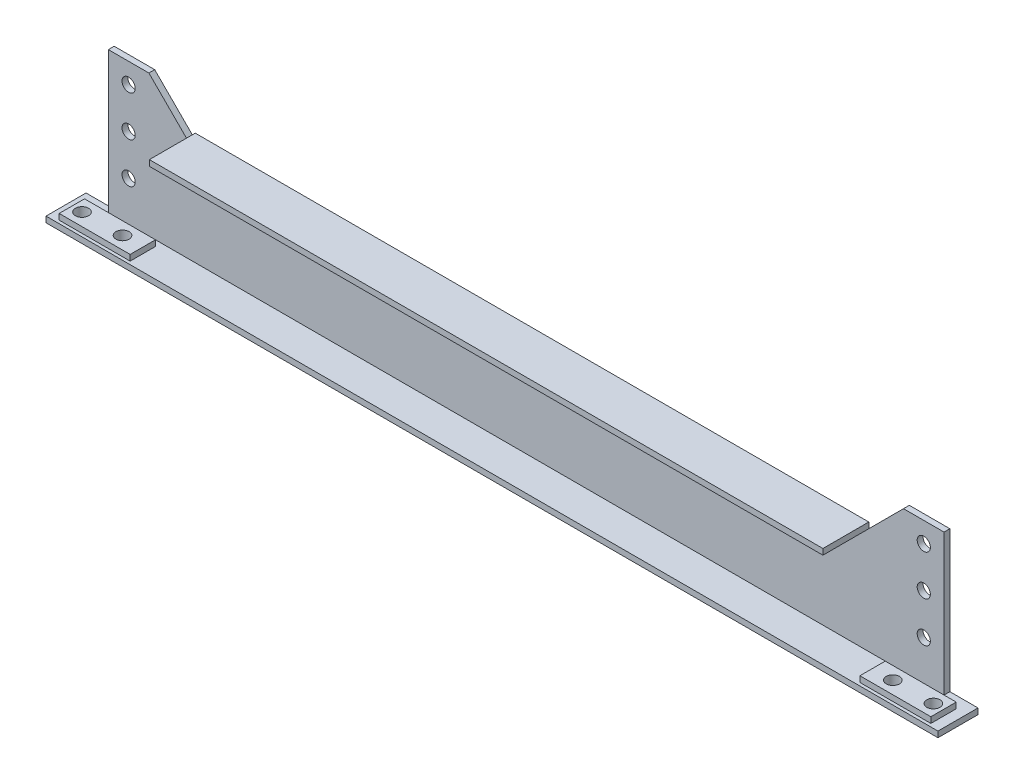
ISO-10303-21;
HEADER;
FILE_DESCRIPTION(('STEP AP214'),'2;1');
FILE_NAME('part.step','',(''),(''),'','','');
FILE_SCHEMA(('AUTOMOTIVE_DESIGN { 1 0 10303 214 1 1 1 1 }'));
ENDSEC;
DATA;
#1=APPLICATION_CONTEXT('core data for automotive mechanical design processes');
#2=APPLICATION_PROTOCOL_DEFINITION('international standard','automotive_design',2000,#1);
#3=PRODUCT_CONTEXT('',#1,'mechanical');
#4=PRODUCT('Part','Part','',(#3));
#5=PRODUCT_RELATED_PRODUCT_CATEGORY('part','',(#4));
#6=PRODUCT_DEFINITION_FORMATION('','',#4);
#7=PRODUCT_DEFINITION_CONTEXT('part definition',#1,'design');
#8=PRODUCT_DEFINITION('design','',#6,#7);
#9=PRODUCT_DEFINITION_SHAPE('','',#8);
#10=(LENGTH_UNIT() NAMED_UNIT(*) SI_UNIT(.MILLI.,.METRE.));
#11=(NAMED_UNIT(*) PLANE_ANGLE_UNIT() SI_UNIT($,.RADIAN.));
#12=(NAMED_UNIT(*) SI_UNIT($,.STERADIAN.) SOLID_ANGLE_UNIT());
#13=UNCERTAINTY_MEASURE_WITH_UNIT(LENGTH_MEASURE(1.E-05),#10,'distance_accuracy_value','');
#14=(GEOMETRIC_REPRESENTATION_CONTEXT(3) GLOBAL_UNCERTAINTY_ASSIGNED_CONTEXT((#13)) GLOBAL_UNIT_ASSIGNED_CONTEXT((#10,
#11,#12)) REPRESENTATION_CONTEXT('',''));
#15=CARTESIAN_POINT('',(0.,0.,0.));
#16=DIRECTION('',(0.,0.,1.));
#17=DIRECTION('',(1.,0.,0.));
#18=AXIS2_PLACEMENT_3D('',#15,#16,#17);
#19=CARTESIAN_POINT('',(880.,-139.25,79.));
#20=DIRECTION('',(0.,-1.,0.));
#21=DIRECTION('',(1.,0.,0.));
#22=AXIS2_PLACEMENT_3D('',#19,#20,#21);
#23=PLANE('',#22);
#24=DIRECTION('',(0.,0.,1.));
#25=VECTOR('',#24,1.);
#26=CARTESIAN_POINT('',(720.,-139.25,23.));
#27=LINE('',#26,#25);
#28=CARTESIAN_POINT('',(720.,-139.25,23.));
#29=VERTEX_POINT('',#28);
#30=CARTESIAN_POINT('',(720.,-139.25,73.));
#31=VERTEX_POINT('',#30);
#32=EDGE_CURVE('E214',#29,#31,#27,.T.);
#33=ORIENTED_EDGE('',*,*,#32,.F.);
#34=DIRECTION('',(-1.,0.,0.));
#35=VECTOR('',#34,1.);
#36=CARTESIAN_POINT('',(720.,-139.25,23.));
#37=LINE('',#36,#35);
#38=CARTESIAN_POINT('',(860.,-139.25,23.));
#39=VERTEX_POINT('',#38);
#40=EDGE_CURVE('E227',#39,#29,#37,.T.);
#41=ORIENTED_EDGE('',*,*,#40,.F.);
#42=DIRECTION('',(0.,0.,-1.));
#43=VECTOR('',#42,1.);
#44=CARTESIAN_POINT('',(860.,-139.25,23.));
#45=LINE('',#44,#43);
#46=CARTESIAN_POINT('',(860.,-139.25,73.));
#47=VERTEX_POINT('',#46);
#48=EDGE_CURVE('E236',#47,#39,#45,.T.);
#49=ORIENTED_EDGE('',*,*,#48,.F.);
#50=DIRECTION('',(1.,0.,0.));
#51=VECTOR('',#50,1.);
#52=CARTESIAN_POINT('',(720.,-139.25,73.));
#53=LINE('',#52,#51);
#54=EDGE_CURVE('E217',#31,#47,#53,.T.);
#55=ORIENTED_EDGE('',*,*,#54,.F.);
#56=EDGE_LOOP('',(#33,#41,#49,#55));
#57=FACE_BOUND('',#56,.T.);
#58=DIRECTION('',(0.,0.,-1.));
#59=VECTOR('',#58,1.);
#60=CARTESIAN_POINT('',(824.5,-139.25,11.5));
#61=LINE('',#60,#59);
#62=CARTESIAN_POINT('',(824.5,-139.25,11.5));
#63=VERTEX_POINT('',#62);
#64=CARTESIAN_POINT('',(824.5,-139.25,0.));
#65=VERTEX_POINT('',#64);
#66=EDGE_CURVE('E45',#63,#65,#61,.T.);
#67=ORIENTED_EDGE('',*,*,#66,.F.);
#68=DIRECTION('',(1.,0.,0.));
#69=VECTOR('',#68,1.);
#70=CARTESIAN_POINT('',(-824.5,-139.25,11.5));
#71=LINE('',#70,#69);
#72=CARTESIAN_POINT('',(-824.5,-139.25,11.5));
#73=VERTEX_POINT('',#72);
#74=EDGE_CURVE('E523',#73,#63,#71,.T.);
#75=ORIENTED_EDGE('',*,*,#74,.F.);
#76=DIRECTION('',(0.,0.,-1.));
#77=VECTOR('',#76,1.);
#78=CARTESIAN_POINT('',(-824.5,-139.25,11.5));
#79=LINE('',#78,#77);
#80=CARTESIAN_POINT('',(-824.5,-139.25,0.));
#81=VERTEX_POINT('',#80);
#82=EDGE_CURVE('E11',#73,#81,#79,.T.);
#83=ORIENTED_EDGE('',*,*,#82,.T.);
#84=DIRECTION('',(-1.,0.,0.));
#85=VECTOR('',#84,1.);
#86=CARTESIAN_POINT('',(880.,-139.25,0.));
#87=LINE('',#86,#85);
#88=CARTESIAN_POINT('',(-880.,-139.25,0.));
#89=VERTEX_POINT('',#88);
#90=EDGE_CURVE('E255',#81,#89,#87,.T.);
#91=ORIENTED_EDGE('',*,*,#90,.T.);
#92=DIRECTION('',(0.,0.,-1.));
#93=VECTOR('',#92,1.);
#94=CARTESIAN_POINT('',(-880.,-139.25,79.));
#95=LINE('',#94,#93);
#96=CARTESIAN_POINT('',(-880.,-139.25,79.));
#97=VERTEX_POINT('',#96);
#98=EDGE_CURVE('E270',#97,#89,#95,.T.);
#99=ORIENTED_EDGE('',*,*,#98,.F.);
#100=DIRECTION('',(-1.,0.,0.));
#101=VECTOR('',#100,1.);
#102=CARTESIAN_POINT('',(880.,-139.25,79.));
#103=LINE('',#102,#101);
#104=CARTESIAN_POINT('',(880.,-139.25,79.));
#105=VERTEX_POINT('',#104);
#106=EDGE_CURVE('E281',#105,#97,#103,.T.);
#107=ORIENTED_EDGE('',*,*,#106,.F.);
#108=DIRECTION('',(0.,0.,-1.));
#109=VECTOR('',#108,1.);
#110=CARTESIAN_POINT('',(880.,-139.25,79.));
#111=LINE('',#110,#109);
#112=CARTESIAN_POINT('',(880.,-139.25,0.));
#113=VERTEX_POINT('',#112);
#114=EDGE_CURVE('E267',#105,#113,#111,.T.);
#115=ORIENTED_EDGE('',*,*,#114,.T.);
#116=EDGE_CURVE('E264',#113,#65,#87,.T.);
#117=ORIENTED_EDGE('',*,*,#116,.T.);
#118=EDGE_LOOP('',(#67,#75,#83,#91,#99,#107,#115,#117));
#119=FACE_BOUND('',#118,.T.);
#120=DIRECTION('',(0.,0.,-1.));
#121=VECTOR('',#120,1.);
#122=CARTESIAN_POINT('',(-720.,-139.25,23.));
#123=LINE('',#122,#121);
#124=CARTESIAN_POINT('',(-720.,-139.25,73.));
#125=VERTEX_POINT('',#124);
#126=CARTESIAN_POINT('',(-720.,-139.25,23.));
#127=VERTEX_POINT('',#126);
#128=EDGE_CURVE('E213',#125,#127,#123,.T.);
#129=ORIENTED_EDGE('',*,*,#128,.F.);
#130=DIRECTION('',(1.,0.,0.));
#131=VECTOR('',#130,1.);
#132=CARTESIAN_POINT('',(-720.,-139.25,73.));
#133=LINE('',#132,#131);
#134=CARTESIAN_POINT('',(-860.,-139.25,73.));
#135=VERTEX_POINT('',#134);
#136=EDGE_CURVE('E210',#135,#125,#133,.T.);
#137=ORIENTED_EDGE('',*,*,#136,.F.);
#138=DIRECTION('',(0.,0.,1.));
#139=VECTOR('',#138,1.);
#140=CARTESIAN_POINT('',(-860.,-139.25,23.));
#141=LINE('',#140,#139);
#142=CARTESIAN_POINT('',(-860.,-139.25,23.));
#143=VERTEX_POINT('',#142);
#144=EDGE_CURVE('E58',#143,#135,#141,.T.);
#145=ORIENTED_EDGE('',*,*,#144,.F.);
#146=DIRECTION('',(-1.,0.,0.));
#147=VECTOR('',#146,1.);
#148=CARTESIAN_POINT('',(-720.,-139.25,23.));
#149=LINE('',#148,#147);
#150=EDGE_CURVE('E53',#127,#143,#149,.T.);
#151=ORIENTED_EDGE('',*,*,#150,.F.);
#152=EDGE_LOOP('',(#129,#137,#145,#151));
#153=FACE_BOUND('',#152,.T.);
#154=ADVANCED_FACE('F36',(#57,#119,#153),#23,.F.);
#155=CARTESIAN_POINT('',(-824.5,59.2499999999996,11.5));
#156=DIRECTION('',(0.,0.,1.));
#157=DIRECTION('',(1.,0.,0.));
#158=AXIS2_PLACEMENT_3D('',#155,#156,#157);
#159=PLANE('',#158);
#160=CARTESIAN_POINT('',(784.5,19.2499999999996,11.5));
#161=DIRECTION('',(0.,0.,1.));
#162=DIRECTION('',(-1.,0.,0.));
#163=AXIS2_PLACEMENT_3D('',#160,#161,#162);
#164=CIRCLE('',#163,13.);
#165=CARTESIAN_POINT('',(771.5,19.2499999999996,11.5));
#166=VERTEX_POINT('',#165);
#167=EDGE_CURVE('E545',#166,#166,#164,.T.);
#168=ORIENTED_EDGE('',*,*,#167,.F.);
#169=EDGE_LOOP('',(#168));
#170=FACE_BOUND('',#169,.T.);
#171=CARTESIAN_POINT('',(-784.5,-60.7500000000004,11.5));
#172=DIRECTION('',(0.,0.,1.));
#173=DIRECTION('',(1.,0.,0.));
#174=AXIS2_PLACEMENT_3D('',#171,#172,#173);
#175=CIRCLE('',#174,13.);
#176=CARTESIAN_POINT('',(-771.5,-60.7500000000004,11.5));
#177=VERTEX_POINT('',#176);
#178=EDGE_CURVE('E533',#177,#177,#175,.T.);
#179=ORIENTED_EDGE('',*,*,#178,.F.);
#180=EDGE_LOOP('',(#179));
#181=FACE_BOUND('',#180,.T.);
#182=CARTESIAN_POINT('',(-784.5,99.2499999999996,11.5));
#183=DIRECTION('',(0.,0.,1.));
#184=DIRECTION('',(1.,0.,0.));
#185=AXIS2_PLACEMENT_3D('',#182,#183,#184);
#186=CIRCLE('',#185,13.);
#187=CARTESIAN_POINT('',(-771.5,99.2499999999996,11.5));
#188=VERTEX_POINT('',#187);
#189=EDGE_CURVE('E324',#188,#188,#186,.T.);
#190=ORIENTED_EDGE('',*,*,#189,.F.);
#191=EDGE_LOOP('',(#190));
#192=FACE_BOUND('',#191,.T.);
#193=DIRECTION('',(0.,-1.,0.));
#194=VECTOR('',#193,1.);
#195=CARTESIAN_POINT('',(-824.5,139.25,11.5));
#196=LINE('',#195,#194);
#197=CARTESIAN_POINT('',(-824.5,139.25,11.5));
#198=VERTEX_POINT('',#197);
#199=EDGE_CURVE('E493',#198,#73,#196,.T.);
#200=ORIENTED_EDGE('',*,*,#199,.T.);
#201=ORIENTED_EDGE('',*,*,#74,.T.);
#202=DIRECTION('',(0.,1.,0.));
#203=VECTOR('',#202,1.);
#204=CARTESIAN_POINT('',(824.5,139.25,11.5));
#205=LINE('',#204,#203);
#206=CARTESIAN_POINT('',(824.5,139.25,11.5));
#207=VERTEX_POINT('',#206);
#208=EDGE_CURVE('E514',#63,#207,#205,.T.);
#209=ORIENTED_EDGE('',*,*,#208,.T.);
#210=DIRECTION('',(-1.,0.,0.));
#211=VECTOR('',#210,1.);
#212=CARTESIAN_POINT('',(744.5,139.25,11.5));
#213=LINE('',#212,#211);
#214=CARTESIAN_POINT('',(744.5,139.25,11.5));
#215=VERTEX_POINT('',#214);
#216=EDGE_CURVE('E478',#207,#215,#213,.T.);
#217=ORIENTED_EDGE('',*,*,#216,.T.);
#218=DIRECTION('',(-0.707106781186546,-0.707106781186549,0.));
#219=VECTOR('',#218,1.);
#220=CARTESIAN_POINT('',(744.5,139.25,11.5));
#221=LINE('',#220,#219);
#222=CARTESIAN_POINT('',(664.5,59.2499999999996,11.5));
#223=VERTEX_POINT('',#222);
#224=EDGE_CURVE('E507',#215,#223,#221,.T.);
#225=ORIENTED_EDGE('',*,*,#224,.T.);
#226=DIRECTION('',(-1.,0.,0.));
#227=VECTOR('',#226,1.);
#228=CARTESIAN_POINT('',(-664.5,59.2499999999996,11.5));
#229=LINE('',#228,#227);
#230=CARTESIAN_POINT('',(-664.5,59.2499999999996,11.5));
#231=VERTEX_POINT('',#230);
#232=EDGE_CURVE('E510',#223,#231,#229,.T.);
#233=ORIENTED_EDGE('',*,*,#232,.T.);
#234=DIRECTION('',(-0.707106781186547,0.707106781186548,0.));
#235=VECTOR('',#234,1.);
#236=CARTESIAN_POINT('',(-744.5,139.25,11.5));
#237=LINE('',#236,#235);
#238=CARTESIAN_POINT('',(-744.5,139.25,11.5));
#239=VERTEX_POINT('',#238);
#240=EDGE_CURVE('E512',#231,#239,#237,.T.);
#241=ORIENTED_EDGE('',*,*,#240,.T.);
#242=DIRECTION('',(-1.,0.,0.));
#243=VECTOR('',#242,1.);
#244=CARTESIAN_POINT('',(-824.5,139.25,11.5));
#245=LINE('',#244,#243);
#246=EDGE_CURVE('E488',#239,#198,#245,.T.);
#247=ORIENTED_EDGE('',*,*,#246,.T.);
#248=EDGE_LOOP('',(#200,#201,#209,#217,#225,#233,#241,#247));
#249=FACE_BOUND('',#248,.T.);
#250=CARTESIAN_POINT('',(-784.5,19.2499999999996,11.5));
#251=DIRECTION('',(0.,0.,1.));
#252=DIRECTION('',(1.,0.,0.));
#253=AXIS2_PLACEMENT_3D('',#250,#251,#252);
#254=CIRCLE('',#253,13.);
#255=CARTESIAN_POINT('',(-771.5,19.2499999999996,11.5));
#256=VERTEX_POINT('',#255);
#257=EDGE_CURVE('E528',#256,#256,#254,.T.);
#258=ORIENTED_EDGE('',*,*,#257,.F.);
#259=EDGE_LOOP('',(#258));
#260=FACE_BOUND('',#259,.T.);
#261=CARTESIAN_POINT('',(784.5,-60.7500000000004,11.5));
#262=DIRECTION('',(0.,0.,1.));
#263=DIRECTION('',(-1.,0.,0.));
#264=AXIS2_PLACEMENT_3D('',#261,#262,#263);
#265=CIRCLE('',#264,13.);
#266=CARTESIAN_POINT('',(771.5,-60.7500000000004,11.5));
#267=VERTEX_POINT('',#266);
#268=EDGE_CURVE('E539',#267,#267,#265,.T.);
#269=ORIENTED_EDGE('',*,*,#268,.F.);
#270=EDGE_LOOP('',(#269));
#271=FACE_BOUND('',#270,.T.);
#272=CARTESIAN_POINT('',(784.5,99.2499999999996,11.5));
#273=DIRECTION('',(0.,0.,1.));
#274=DIRECTION('',(-1.,0.,0.));
#275=AXIS2_PLACEMENT_3D('',#272,#273,#274);
#276=CIRCLE('',#275,13.);
#277=CARTESIAN_POINT('',(771.5,99.2499999999996,11.5));
#278=VERTEX_POINT('',#277);
#279=EDGE_CURVE('E551',#278,#278,#276,.T.);
#280=ORIENTED_EDGE('',*,*,#279,.F.);
#281=EDGE_LOOP('',(#280));
#282=FACE_BOUND('',#281,.T.);
#283=ADVANCED_FACE('F390',(#170,#181,#192,#249,#260,#271,#282),#159,.T.);
#284=CARTESIAN_POINT('',(-824.5,59.2499999999996,0.));
#285=DIRECTION('',(0.,0.,1.));
#286=DIRECTION('',(1.,0.,0.));
#287=AXIS2_PLACEMENT_3D('',#284,#285,#286);
#288=PLANE('',#287);
#289=CARTESIAN_POINT('',(784.5,19.2499999999996,0.));
#290=DIRECTION('',(0.,0.,1.));
#291=DIRECTION('',(-1.,0.,0.));
#292=AXIS2_PLACEMENT_3D('',#289,#290,#291);
#293=CIRCLE('',#292,13.);
#294=CARTESIAN_POINT('',(771.5,19.2499999999996,0.));
#295=VERTEX_POINT('',#294);
#296=EDGE_CURVE('E548',#295,#295,#293,.T.);
#297=ORIENTED_EDGE('',*,*,#296,.T.);
#298=EDGE_LOOP('',(#297));
#299=FACE_BOUND('',#298,.T.);
#300=CARTESIAN_POINT('',(-784.5,-60.7500000000004,0.));
#301=DIRECTION('',(0.,0.,1.));
#302=DIRECTION('',(1.,0.,0.));
#303=AXIS2_PLACEMENT_3D('',#300,#301,#302);
#304=CIRCLE('',#303,13.);
#305=CARTESIAN_POINT('',(-771.5,-60.7500000000004,0.));
#306=VERTEX_POINT('',#305);
#307=EDGE_CURVE('E536',#306,#306,#304,.T.);
#308=ORIENTED_EDGE('',*,*,#307,.T.);
#309=EDGE_LOOP('',(#308));
#310=FACE_BOUND('',#309,.T.);
#311=CARTESIAN_POINT('',(-784.5,99.2499999999996,0.));
#312=DIRECTION('',(0.,0.,1.));
#313=DIRECTION('',(1.,0.,0.));
#314=AXIS2_PLACEMENT_3D('',#311,#312,#313);
#315=CIRCLE('',#314,13.);
#316=CARTESIAN_POINT('',(-771.5,99.2499999999996,0.));
#317=VERTEX_POINT('',#316);
#318=EDGE_CURVE('E329',#317,#317,#315,.T.);
#319=ORIENTED_EDGE('',*,*,#318,.T.);
#320=EDGE_LOOP('',(#319));
#321=FACE_BOUND('',#320,.T.);
#322=DIRECTION('',(0.,-1.,0.));
#323=VECTOR('',#322,1.);
#324=CARTESIAN_POINT('',(-824.5,139.25,0.));
#325=LINE('',#324,#323);
#326=CARTESIAN_POINT('',(-824.5,139.25,0.));
#327=VERTEX_POINT('',#326);
#328=EDGE_CURVE('E318',#327,#81,#325,.T.);
#329=ORIENTED_EDGE('',*,*,#328,.F.);
#330=DIRECTION('',(-1.,0.,0.));
#331=VECTOR('',#330,1.);
#332=CARTESIAN_POINT('',(-824.5,139.25,0.));
#333=LINE('',#332,#331);
#334=CARTESIAN_POINT('',(-744.5,139.25,0.));
#335=VERTEX_POINT('',#334);
#336=EDGE_CURVE('E320',#335,#327,#333,.T.);
#337=ORIENTED_EDGE('',*,*,#336,.F.);
#338=DIRECTION('',(-0.707106781186547,0.707106781186548,0.));
#339=VECTOR('',#338,1.);
#340=CARTESIAN_POINT('',(-744.5,139.25,0.));
#341=LINE('',#340,#339);
#342=CARTESIAN_POINT('',(-664.5,59.2499999999996,0.));
#343=VERTEX_POINT('',#342);
#344=EDGE_CURVE('E485',#343,#335,#341,.T.);
#345=ORIENTED_EDGE('',*,*,#344,.F.);
#346=DIRECTION('',(0.,-1.,0.));
#347=VECTOR('',#346,1.);
#348=CARTESIAN_POINT('',(-664.5,59.2499999999996,0.));
#349=LINE('',#348,#347);
#350=CARTESIAN_POINT('',(-664.5,70.7499999999995,0.));
#351=VERTEX_POINT('',#350);
#352=EDGE_CURVE('E269',#351,#343,#349,.T.);
#353=ORIENTED_EDGE('',*,*,#352,.F.);
#354=DIRECTION('',(-1.,0.,0.));
#355=VECTOR('',#354,1.);
#356=CARTESIAN_POINT('',(-664.5,70.7499999999995,0.));
#357=LINE('',#356,#355);
#358=CARTESIAN_POINT('',(664.5,70.7499999999995,0.));
#359=VERTEX_POINT('',#358);
#360=EDGE_CURVE('E578',#359,#351,#357,.T.);
#361=ORIENTED_EDGE('',*,*,#360,.F.);
#362=DIRECTION('',(0.,1.,0.));
#363=VECTOR('',#362,1.);
#364=CARTESIAN_POINT('',(664.5,59.2499999999996,0.));
#365=LINE('',#364,#363);
#366=CARTESIAN_POINT('',(664.5,59.2499999999996,0.));
#367=VERTEX_POINT('',#366);
#368=EDGE_CURVE('E581',#367,#359,#365,.T.);
#369=ORIENTED_EDGE('',*,*,#368,.F.);
#370=DIRECTION('',(-0.707106781186546,-0.707106781186549,0.));
#371=VECTOR('',#370,1.);
#372=CARTESIAN_POINT('',(744.5,139.25,0.));
#373=LINE('',#372,#371);
#374=CARTESIAN_POINT('',(744.5,139.25,0.));
#375=VERTEX_POINT('',#374);
#376=EDGE_CURVE('E483',#375,#367,#373,.T.);
#377=ORIENTED_EDGE('',*,*,#376,.F.);
#378=DIRECTION('',(-1.,0.,0.));
#379=VECTOR('',#378,1.);
#380=CARTESIAN_POINT('',(744.5,139.25,0.));
#381=LINE('',#380,#379);
#382=CARTESIAN_POINT('',(824.5,139.25,0.));
#383=VERTEX_POINT('',#382);
#384=EDGE_CURVE('E326',#383,#375,#381,.T.);
#385=ORIENTED_EDGE('',*,*,#384,.F.);
#386=DIRECTION('',(0.,1.,0.));
#387=VECTOR('',#386,1.);
#388=CARTESIAN_POINT('',(824.5,139.25,0.));
#389=LINE('',#388,#387);
#390=EDGE_CURVE('E323',#65,#383,#389,.T.);
#391=ORIENTED_EDGE('',*,*,#390,.F.);
#392=ORIENTED_EDGE('',*,*,#116,.F.);
#393=DIRECTION('',(0.,1.,0.));
#394=VECTOR('',#393,1.);
#395=CARTESIAN_POINT('',(880.,-139.25,0.));
#396=LINE('',#395,#394);
#397=CARTESIAN_POINT('',(880.,-150.75,0.));
#398=VERTEX_POINT('',#397);
#399=EDGE_CURVE('E252',#398,#113,#396,.T.);
#400=ORIENTED_EDGE('',*,*,#399,.F.);
#401=DIRECTION('',(1.,0.,0.));
#402=VECTOR('',#401,1.);
#403=CARTESIAN_POINT('',(880.,-150.75,0.));
#404=LINE('',#403,#402);
#405=CARTESIAN_POINT('',(-880.,-150.75,0.));
#406=VERTEX_POINT('',#405);
#407=EDGE_CURVE('E285',#406,#398,#404,.T.);
#408=ORIENTED_EDGE('',*,*,#407,.F.);
#409=DIRECTION('',(0.,-1.,0.));
#410=VECTOR('',#409,1.);
#411=CARTESIAN_POINT('',(-880.,-139.25,0.));
#412=LINE('',#411,#410);
#413=EDGE_CURVE('E258',#89,#406,#412,.T.);
#414=ORIENTED_EDGE('',*,*,#413,.F.);
#415=ORIENTED_EDGE('',*,*,#90,.F.);
#416=EDGE_LOOP('',(#329,#337,#345,#353,#361,#369,#377,#385,#391,#392,#400,#408,#414,#415));
#417=FACE_BOUND('',#416,.T.);
#418=CARTESIAN_POINT('',(-784.5,19.2499999999996,0.));
#419=DIRECTION('',(0.,0.,1.));
#420=DIRECTION('',(1.,0.,0.));
#421=AXIS2_PLACEMENT_3D('',#418,#419,#420);
#422=CIRCLE('',#421,13.);
#423=CARTESIAN_POINT('',(-771.5,19.2499999999996,0.));
#424=VERTEX_POINT('',#423);
#425=EDGE_CURVE('E530',#424,#424,#422,.T.);
#426=ORIENTED_EDGE('',*,*,#425,.T.);
#427=EDGE_LOOP('',(#426));
#428=FACE_BOUND('',#427,.T.);
#429=CARTESIAN_POINT('',(784.5,-60.7500000000004,0.));
#430=DIRECTION('',(0.,0.,1.));
#431=DIRECTION('',(-1.,0.,0.));
#432=AXIS2_PLACEMENT_3D('',#429,#430,#431);
#433=CIRCLE('',#432,13.);
#434=CARTESIAN_POINT('',(771.5,-60.7500000000004,0.));
#435=VERTEX_POINT('',#434);
#436=EDGE_CURVE('E542',#435,#435,#433,.T.);
#437=ORIENTED_EDGE('',*,*,#436,.T.);
#438=EDGE_LOOP('',(#437));
#439=FACE_BOUND('',#438,.T.);
#440=CARTESIAN_POINT('',(784.5,99.2499999999996,0.));
#441=DIRECTION('',(0.,0.,1.));
#442=DIRECTION('',(-1.,0.,0.));
#443=AXIS2_PLACEMENT_3D('',#440,#441,#442);
#444=CIRCLE('',#443,13.);
#445=CARTESIAN_POINT('',(771.5,99.2499999999996,0.));
#446=VERTEX_POINT('',#445);
#447=EDGE_CURVE('E554',#446,#446,#444,.T.);
#448=ORIENTED_EDGE('',*,*,#447,.T.);
#449=EDGE_LOOP('',(#448));
#450=FACE_BOUND('',#449,.T.);
#451=ADVANCED_FACE('F302',(#299,#310,#321,#417,#428,#439,#450),#288,.F.);
#452=CARTESIAN_POINT('',(-824.5,139.25,11.5));
#453=DIRECTION('',(1.,0.,0.));
#454=DIRECTION('',(0.,0.,-1.));
#455=AXIS2_PLACEMENT_3D('',#452,#453,#454);
#456=PLANE('',#455);
#457=ORIENTED_EDGE('',*,*,#328,.T.);
#458=ORIENTED_EDGE('',*,*,#82,.F.);
#459=ORIENTED_EDGE('',*,*,#199,.F.);
#460=DIRECTION('',(0.,0.,-1.));
#461=VECTOR('',#460,1.);
#462=CARTESIAN_POINT('',(-824.5,139.25,11.5));
#463=LINE('',#462,#461);
#464=EDGE_CURVE('E494',#198,#327,#463,.T.);
#465=ORIENTED_EDGE('',*,*,#464,.T.);
#466=EDGE_LOOP('',(#457,#458,#459,#465));
#467=FACE_BOUND('',#466,.T.);
#468=ADVANCED_FACE('F38',(#467),#456,.F.);
#469=CARTESIAN_POINT('',(824.5,139.25,11.5));
#470=DIRECTION('',(-1.,0.,0.));
#471=DIRECTION('',(0.,0.,1.));
#472=AXIS2_PLACEMENT_3D('',#469,#470,#471);
#473=PLANE('',#472);
#474=ORIENTED_EDGE('',*,*,#390,.T.);
#475=DIRECTION('',(0.,0.,-1.));
#476=VECTOR('',#475,1.);
#477=CARTESIAN_POINT('',(824.5,139.25,11.5));
#478=LINE('',#477,#476);
#479=EDGE_CURVE('E338',#207,#383,#478,.T.);
#480=ORIENTED_EDGE('',*,*,#479,.F.);
#481=ORIENTED_EDGE('',*,*,#208,.F.);
#482=ORIENTED_EDGE('',*,*,#66,.T.);
#483=EDGE_LOOP('',(#474,#480,#481,#482));
#484=FACE_BOUND('',#483,.T.);
#485=ADVANCED_FACE('F464',(#484),#473,.F.);
#486=CARTESIAN_POINT('',(744.5,139.25,11.5));
#487=DIRECTION('',(0.,-1.,0.));
#488=DIRECTION('',(1.,0.,0.));
#489=AXIS2_PLACEMENT_3D('',#486,#487,#488);
#490=PLANE('',#489);
#491=ORIENTED_EDGE('',*,*,#384,.T.);
#492=DIRECTION('',(0.,0.,-1.));
#493=VECTOR('',#492,1.);
#494=CARTESIAN_POINT('',(744.5,139.25,11.5));
#495=LINE('',#494,#493);
#496=EDGE_CURVE('E479',#215,#375,#495,.T.);
#497=ORIENTED_EDGE('',*,*,#496,.F.);
#498=ORIENTED_EDGE('',*,*,#216,.F.);
#499=ORIENTED_EDGE('',*,*,#479,.T.);
#500=EDGE_LOOP('',(#491,#497,#498,#499));
#501=FACE_BOUND('',#500,.T.);
#502=ADVANCED_FACE('F461',(#501),#490,.F.);
#503=CARTESIAN_POINT('',(744.5,139.25,11.5));
#504=DIRECTION('',(0.707106781186549,-0.707106781186546,0.));
#505=DIRECTION('',(0.707106781186546,0.707106781186549,0.));
#506=AXIS2_PLACEMENT_3D('',#503,#504,#505);
#507=PLANE('',#506);
#508=ORIENTED_EDGE('',*,*,#376,.T.);
#509=DIRECTION('',(0.,0.,-1.));
#510=VECTOR('',#509,1.);
#511=CARTESIAN_POINT('',(664.5,59.2499999999996,11.5));
#512=LINE('',#511,#510);
#513=EDGE_CURVE('E502',#223,#367,#512,.T.);
#514=ORIENTED_EDGE('',*,*,#513,.F.);
#515=ORIENTED_EDGE('',*,*,#224,.F.);
#516=ORIENTED_EDGE('',*,*,#496,.T.);
#517=EDGE_LOOP('',(#508,#514,#515,#516));
#518=FACE_BOUND('',#517,.T.);
#519=ADVANCED_FACE('F457',(#518),#507,.F.);
#520=CARTESIAN_POINT('',(-744.5,139.25,11.5));
#521=DIRECTION('',(-0.707106781186548,-0.707106781186547,0.));
#522=DIRECTION('',(0.707106781186547,-0.707106781186548,0.));
#523=AXIS2_PLACEMENT_3D('',#520,#521,#522);
#524=PLANE('',#523);
#525=ORIENTED_EDGE('',*,*,#344,.T.);
#526=DIRECTION('',(0.,0.,-1.));
#527=VECTOR('',#526,1.);
#528=CARTESIAN_POINT('',(-744.5,139.25,11.5));
#529=LINE('',#528,#527);
#530=EDGE_CURVE('E496',#239,#335,#529,.T.);
#531=ORIENTED_EDGE('',*,*,#530,.F.);
#532=ORIENTED_EDGE('',*,*,#240,.F.);
#533=DIRECTION('',(0.,0.,-1.));
#534=VECTOR('',#533,1.);
#535=CARTESIAN_POINT('',(-664.5,59.2499999999996,11.5));
#536=LINE('',#535,#534);
#537=EDGE_CURVE('E499',#231,#343,#536,.T.);
#538=ORIENTED_EDGE('',*,*,#537,.T.);
#539=EDGE_LOOP('',(#525,#531,#532,#538));
#540=FACE_BOUND('',#539,.T.);
#541=ADVANCED_FACE('F453',(#540),#524,.F.);
#542=CARTESIAN_POINT('',(-824.5,139.25,11.5));
#543=DIRECTION('',(0.,-1.,0.));
#544=DIRECTION('',(1.,0.,0.));
#545=AXIS2_PLACEMENT_3D('',#542,#543,#544);
#546=PLANE('',#545);
#547=ORIENTED_EDGE('',*,*,#336,.T.);
#548=ORIENTED_EDGE('',*,*,#464,.F.);
#549=ORIENTED_EDGE('',*,*,#246,.F.);
#550=ORIENTED_EDGE('',*,*,#530,.T.);
#551=EDGE_LOOP('',(#547,#548,#549,#550));
#552=FACE_BOUND('',#551,.T.);
#553=ADVANCED_FACE('F445',(#552),#546,.F.);
#554=CARTESIAN_POINT('',(-784.5,99.2499999999996,11.5));
#555=DIRECTION('',(0.,0.,-1.));
#556=DIRECTION('',(-1.,0.,0.));
#557=AXIS2_PLACEMENT_3D('',#554,#555,#556);
#558=CYLINDRICAL_SURFACE('',#557,13.);
#559=ORIENTED_EDGE('',*,*,#189,.T.);
#560=EDGE_LOOP('',(#559));
#561=FACE_BOUND('',#560,.T.);
#562=ORIENTED_EDGE('',*,*,#318,.F.);
#563=EDGE_LOOP('',(#562));
#564=FACE_BOUND('',#563,.T.);
#565=ADVANCED_FACE('F442',(#561,#564),#558,.F.);
#566=CARTESIAN_POINT('',(-784.5,19.2499999999996,11.5));
#567=DIRECTION('',(0.,0.,-1.));
#568=DIRECTION('',(-1.,0.,0.));
#569=AXIS2_PLACEMENT_3D('',#566,#567,#568);
#570=CYLINDRICAL_SURFACE('',#569,13.);
#571=ORIENTED_EDGE('',*,*,#257,.T.);
#572=EDGE_LOOP('',(#571));
#573=FACE_BOUND('',#572,.T.);
#574=ORIENTED_EDGE('',*,*,#425,.F.);
#575=EDGE_LOOP('',(#574));
#576=FACE_BOUND('',#575,.T.);
#577=ADVANCED_FACE('F438',(#573,#576),#570,.F.);
#578=CARTESIAN_POINT('',(-784.5,-60.7500000000004,11.5));
#579=DIRECTION('',(0.,0.,-1.));
#580=DIRECTION('',(-1.,0.,0.));
#581=AXIS2_PLACEMENT_3D('',#578,#579,#580);
#582=CYLINDRICAL_SURFACE('',#581,13.);
#583=ORIENTED_EDGE('',*,*,#178,.T.);
#584=EDGE_LOOP('',(#583));
#585=FACE_BOUND('',#584,.T.);
#586=ORIENTED_EDGE('',*,*,#307,.F.);
#587=EDGE_LOOP('',(#586));
#588=FACE_BOUND('',#587,.T.);
#589=ADVANCED_FACE('F434',(#585,#588),#582,.F.);
#590=CARTESIAN_POINT('',(784.5,-60.7500000000004,11.5));
#591=DIRECTION('',(0.,0.,-1.));
#592=DIRECTION('',(-1.,0.,0.));
#593=AXIS2_PLACEMENT_3D('',#590,#591,#592);
#594=CYLINDRICAL_SURFACE('',#593,13.);
#595=ORIENTED_EDGE('',*,*,#268,.T.);
#596=EDGE_LOOP('',(#595));
#597=FACE_BOUND('',#596,.T.);
#598=ORIENTED_EDGE('',*,*,#436,.F.);
#599=EDGE_LOOP('',(#598));
#600=FACE_BOUND('',#599,.T.);
#601=ADVANCED_FACE('F430',(#597,#600),#594,.F.);
#602=CARTESIAN_POINT('',(784.5,19.2499999999996,11.5));
#603=DIRECTION('',(0.,0.,-1.));
#604=DIRECTION('',(-1.,0.,0.));
#605=AXIS2_PLACEMENT_3D('',#602,#603,#604);
#606=CYLINDRICAL_SURFACE('',#605,13.);
#607=ORIENTED_EDGE('',*,*,#167,.T.);
#608=EDGE_LOOP('',(#607));
#609=FACE_BOUND('',#608,.T.);
#610=ORIENTED_EDGE('',*,*,#296,.F.);
#611=EDGE_LOOP('',(#610));
#612=FACE_BOUND('',#611,.T.);
#613=ADVANCED_FACE('F426',(#609,#612),#606,.F.);
#614=CARTESIAN_POINT('',(784.5,99.2499999999996,11.5));
#615=DIRECTION('',(0.,0.,-1.));
#616=DIRECTION('',(-1.,0.,0.));
#617=AXIS2_PLACEMENT_3D('',#614,#615,#616);
#618=CYLINDRICAL_SURFACE('',#617,13.);
#619=ORIENTED_EDGE('',*,*,#279,.T.);
#620=EDGE_LOOP('',(#619));
#621=FACE_BOUND('',#620,.T.);
#622=ORIENTED_EDGE('',*,*,#447,.F.);
#623=EDGE_LOOP('',(#622));
#624=FACE_BOUND('',#623,.T.);
#625=ADVANCED_FACE('F422',(#621,#624),#618,.F.);
#626=CARTESIAN_POINT('',(-664.5,59.2499999999996,90.5));
#627=DIRECTION('',(1.,0.,0.));
#628=DIRECTION('',(0.,0.,-1.));
#629=AXIS2_PLACEMENT_3D('',#626,#627,#628);
#630=PLANE('',#629);
#631=DIRECTION('',(0.,0.,-1.));
#632=VECTOR('',#631,1.);
#633=CARTESIAN_POINT('',(-664.5,70.7499999999995,90.5));
#634=LINE('',#633,#632);
#635=CARTESIAN_POINT('',(-664.5,70.7499999999995,90.5));
#636=VERTEX_POINT('',#635);
#637=EDGE_CURVE('E567',#636,#351,#634,.T.);
#638=ORIENTED_EDGE('',*,*,#637,.T.);
#639=ORIENTED_EDGE('',*,*,#352,.T.);
#640=ORIENTED_EDGE('',*,*,#537,.F.);
#641=DIRECTION('',(0.,0.,-1.));
#642=VECTOR('',#641,1.);
#643=CARTESIAN_POINT('',(-664.5,59.2499999999996,90.5));
#644=LINE('',#643,#642);
#645=CARTESIAN_POINT('',(-664.5,59.2499999999996,90.5));
#646=VERTEX_POINT('',#645);
#647=EDGE_CURVE('E557',#646,#231,#644,.T.);
#648=ORIENTED_EDGE('',*,*,#647,.F.);
#649=DIRECTION('',(0.,-1.,0.));
#650=VECTOR('',#649,1.);
#651=CARTESIAN_POINT('',(-664.5,59.2499999999996,90.5));
#652=LINE('',#651,#650);
#653=EDGE_CURVE('E575',#636,#646,#652,.T.);
#654=ORIENTED_EDGE('',*,*,#653,.F.);
#655=EDGE_LOOP('',(#638,#639,#640,#648,#654));
#656=FACE_BOUND('',#655,.T.);
#657=ADVANCED_FACE('F418',(#656),#630,.F.);
#658=CARTESIAN_POINT('',(-664.5,59.2499999999996,90.5));
#659=DIRECTION('',(0.,1.,0.));
#660=DIRECTION('',(0.,0.,1.));
#661=AXIS2_PLACEMENT_3D('',#658,#659,#660);
#662=PLANE('',#661);
#663=ORIENTED_EDGE('',*,*,#232,.F.);
#664=DIRECTION('',(0.,0.,-1.));
#665=VECTOR('',#664,1.);
#666=CARTESIAN_POINT('',(664.5,59.2499999999996,90.5));
#667=LINE('',#666,#665);
#668=CARTESIAN_POINT('',(664.5,59.2499999999996,90.5));
#669=VERTEX_POINT('',#668);
#670=EDGE_CURVE('E562',#669,#223,#667,.T.);
#671=ORIENTED_EDGE('',*,*,#670,.F.);
#672=DIRECTION('',(1.,0.,0.));
#673=VECTOR('',#672,1.);
#674=CARTESIAN_POINT('',(-664.5,59.2499999999996,90.5));
#675=LINE('',#674,#673);
#676=EDGE_CURVE('E573',#646,#669,#675,.T.);
#677=ORIENTED_EDGE('',*,*,#676,.F.);
#678=ORIENTED_EDGE('',*,*,#647,.T.);
#679=EDGE_LOOP('',(#663,#671,#677,#678));
#680=FACE_BOUND('',#679,.T.);
#681=ADVANCED_FACE('F414',(#680),#662,.F.);
#682=CARTESIAN_POINT('',(664.5,59.2499999999996,90.5));
#683=DIRECTION('',(-1.,0.,0.));
#684=DIRECTION('',(0.,0.,1.));
#685=AXIS2_PLACEMENT_3D('',#682,#683,#684);
#686=PLANE('',#685);
#687=ORIENTED_EDGE('',*,*,#670,.T.);
#688=ORIENTED_EDGE('',*,*,#513,.T.);
#689=ORIENTED_EDGE('',*,*,#368,.T.);
#690=DIRECTION('',(0.,0.,-1.));
#691=VECTOR('',#690,1.);
#692=CARTESIAN_POINT('',(664.5,70.7499999999995,90.5));
#693=LINE('',#692,#691);
#694=CARTESIAN_POINT('',(664.5,70.7499999999995,90.5));
#695=VERTEX_POINT('',#694);
#696=EDGE_CURVE('E565',#695,#359,#693,.T.);
#697=ORIENTED_EDGE('',*,*,#696,.F.);
#698=DIRECTION('',(0.,1.,0.));
#699=VECTOR('',#698,1.);
#700=CARTESIAN_POINT('',(664.5,59.2499999999996,90.5));
#701=LINE('',#700,#699);
#702=EDGE_CURVE('E571',#669,#695,#701,.T.);
#703=ORIENTED_EDGE('',*,*,#702,.F.);
#704=EDGE_LOOP('',(#687,#688,#689,#697,#703));
#705=FACE_BOUND('',#704,.T.);
#706=ADVANCED_FACE('F410',(#705),#686,.F.);
#707=CARTESIAN_POINT('',(-664.5,70.7499999999995,90.5));
#708=DIRECTION('',(0.,-1.,0.));
#709=DIRECTION('',(0.,0.,-1.));
#710=AXIS2_PLACEMENT_3D('',#707,#708,#709);
#711=PLANE('',#710);
#712=ORIENTED_EDGE('',*,*,#696,.T.);
#713=ORIENTED_EDGE('',*,*,#360,.T.);
#714=ORIENTED_EDGE('',*,*,#637,.F.);
#715=DIRECTION('',(-1.,0.,0.));
#716=VECTOR('',#715,1.);
#717=CARTESIAN_POINT('',(-664.5,70.7499999999995,90.5));
#718=LINE('',#717,#716);
#719=EDGE_CURVE('E569',#695,#636,#718,.T.);
#720=ORIENTED_EDGE('',*,*,#719,.F.);
#721=EDGE_LOOP('',(#712,#713,#714,#720));
#722=FACE_BOUND('',#721,.T.);
#723=ADVANCED_FACE('F406',(#722),#711,.F.);
#724=CARTESIAN_POINT('',(-664.5,70.7499999999995,90.5));
#725=DIRECTION('',(0.,0.,-1.));
#726=DIRECTION('',(-1.,0.,0.));
#727=AXIS2_PLACEMENT_3D('',#724,#725,#726);
#728=PLANE('',#727);
#729=ORIENTED_EDGE('',*,*,#653,.T.);
#730=ORIENTED_EDGE('',*,*,#676,.T.);
#731=ORIENTED_EDGE('',*,*,#702,.T.);
#732=ORIENTED_EDGE('',*,*,#719,.T.);
#733=EDGE_LOOP('',(#729,#730,#731,#732));
#734=FACE_BOUND('',#733,.T.);
#735=ADVANCED_FACE('F403',(#734),#728,.F.);
#736=CARTESIAN_POINT('',(880.,-139.25,79.));
#737=DIRECTION('',(-1.,0.,0.));
#738=DIRECTION('',(0.,-1.,0.));
#739=AXIS2_PLACEMENT_3D('',#736,#737,#738);
#740=PLANE('',#739);
#741=DIRECTION('',(0.,0.,-1.));
#742=VECTOR('',#741,1.);
#743=CARTESIAN_POINT('',(880.,-150.75,79.));
#744=LINE('',#743,#742);
#745=CARTESIAN_POINT('',(880.,-150.75,79.));
#746=VERTEX_POINT('',#745);
#747=EDGE_CURVE('E275',#746,#398,#744,.T.);
#748=ORIENTED_EDGE('',*,*,#747,.T.);
#749=ORIENTED_EDGE('',*,*,#399,.T.);
#750=ORIENTED_EDGE('',*,*,#114,.F.);
#751=DIRECTION('',(0.,1.,0.));
#752=VECTOR('',#751,1.);
#753=CARTESIAN_POINT('',(880.,-139.25,79.));
#754=LINE('',#753,#752);
#755=EDGE_CURVE('E283',#746,#105,#754,.T.);
#756=ORIENTED_EDGE('',*,*,#755,.F.);
#757=EDGE_LOOP('',(#748,#749,#750,#756));
#758=FACE_BOUND('',#757,.T.);
#759=ADVANCED_FACE('F308',(#758),#740,.F.);
#760=CARTESIAN_POINT('',(-880.,-139.25,79.));
#761=DIRECTION('',(1.,0.,0.));
#762=DIRECTION('',(0.,1.,0.));
#763=AXIS2_PLACEMENT_3D('',#760,#761,#762);
#764=PLANE('',#763);
#765=ORIENTED_EDGE('',*,*,#98,.T.);
#766=ORIENTED_EDGE('',*,*,#413,.T.);
#767=DIRECTION('',(0.,0.,-1.));
#768=VECTOR('',#767,1.);
#769=CARTESIAN_POINT('',(-880.,-150.75,79.));
#770=LINE('',#769,#768);
#771=CARTESIAN_POINT('',(-880.,-150.75,79.));
#772=VERTEX_POINT('',#771);
#773=EDGE_CURVE('E273',#772,#406,#770,.T.);
#774=ORIENTED_EDGE('',*,*,#773,.F.);
#775=DIRECTION('',(0.,-1.,0.));
#776=VECTOR('',#775,1.);
#777=CARTESIAN_POINT('',(-880.,-139.25,79.));
#778=LINE('',#777,#776);
#779=EDGE_CURVE('E279',#97,#772,#778,.T.);
#780=ORIENTED_EDGE('',*,*,#779,.F.);
#781=EDGE_LOOP('',(#765,#766,#774,#780));
#782=FACE_BOUND('',#781,.T.);
#783=ADVANCED_FACE('F294',(#782),#764,.F.);
#784=CARTESIAN_POINT('',(880.,-150.75,79.));
#785=DIRECTION('',(0.,1.,0.));
#786=DIRECTION('',(-1.,0.,0.));
#787=AXIS2_PLACEMENT_3D('',#784,#785,#786);
#788=PLANE('',#787);
#789=CARTESIAN_POINT('',(840.,-150.75,48.));
#790=DIRECTION('',(0.,-1.,0.));
#791=DIRECTION('',(-1.,0.,0.));
#792=AXIS2_PLACEMENT_3D('',#789,#790,#791);
#793=CIRCLE('',#792,13.);
#794=CARTESIAN_POINT('',(827.,-150.75,48.));
#795=VERTEX_POINT('',#794);
#796=EDGE_CURVE('E362',#795,#795,#793,.T.);
#797=ORIENTED_EDGE('',*,*,#796,.F.);
#798=EDGE_LOOP('',(#797));
#799=FACE_BOUND('',#798,.T.);
#800=CARTESIAN_POINT('',(760.,-150.75,48.));
#801=DIRECTION('',(0.,-1.,0.));
#802=DIRECTION('',(-1.,0.,0.));
#803=AXIS2_PLACEMENT_3D('',#800,#801,#802);
#804=CIRCLE('',#803,13.);
#805=CARTESIAN_POINT('',(747.,-150.75,48.));
#806=VERTEX_POINT('',#805);
#807=EDGE_CURVE('E352',#806,#806,#804,.T.);
#808=ORIENTED_EDGE('',*,*,#807,.F.);
#809=EDGE_LOOP('',(#808));
#810=FACE_BOUND('',#809,.T.);
#811=CARTESIAN_POINT('',(-760.,-150.75,48.));
#812=DIRECTION('',(0.,-1.,0.));
#813=DIRECTION('',(1.,0.,0.));
#814=AXIS2_PLACEMENT_3D('',#811,#812,#813);
#815=CIRCLE('',#814,13.);
#816=CARTESIAN_POINT('',(-747.,-150.75,48.));
#817=VERTEX_POINT('',#816);
#818=EDGE_CURVE('E349',#817,#817,#815,.T.);
#819=ORIENTED_EDGE('',*,*,#818,.F.);
#820=EDGE_LOOP('',(#819));
#821=FACE_BOUND('',#820,.T.);
#822=CARTESIAN_POINT('',(-840.,-150.75,48.));
#823=DIRECTION('',(0.,-1.,0.));
#824=DIRECTION('',(1.,0.,0.));
#825=AXIS2_PLACEMENT_3D('',#822,#823,#824);
#826=CIRCLE('',#825,13.);
#827=CARTESIAN_POINT('',(-827.,-150.75,48.));
#828=VERTEX_POINT('',#827);
#829=EDGE_CURVE('E346',#828,#828,#826,.T.);
#830=ORIENTED_EDGE('',*,*,#829,.F.);
#831=EDGE_LOOP('',(#830));
#832=FACE_BOUND('',#831,.T.);
#833=ORIENTED_EDGE('',*,*,#773,.T.);
#834=ORIENTED_EDGE('',*,*,#407,.T.);
#835=ORIENTED_EDGE('',*,*,#747,.F.);
#836=DIRECTION('',(1.,0.,0.));
#837=VECTOR('',#836,1.);
#838=CARTESIAN_POINT('',(880.,-150.75,79.));
#839=LINE('',#838,#837);
#840=EDGE_CURVE('E277',#772,#746,#839,.T.);
#841=ORIENTED_EDGE('',*,*,#840,.F.);
#842=EDGE_LOOP('',(#833,#834,#835,#841));
#843=FACE_BOUND('',#842,.T.);
#844=ADVANCED_FACE('F310',(#799,#810,#821,#832,#843),#788,.F.);
#845=CARTESIAN_POINT('',(880.,-150.75,79.));
#846=DIRECTION('',(0.,0.,-1.));
#847=DIRECTION('',(-1.,0.,0.));
#848=AXIS2_PLACEMENT_3D('',#845,#846,#847);
#849=PLANE('',#848);
#850=ORIENTED_EDGE('',*,*,#755,.T.);
#851=ORIENTED_EDGE('',*,*,#106,.T.);
#852=ORIENTED_EDGE('',*,*,#779,.T.);
#853=ORIENTED_EDGE('',*,*,#840,.T.);
#854=EDGE_LOOP('',(#850,#851,#852,#853));
#855=FACE_BOUND('',#854,.T.);
#856=ADVANCED_FACE('F312',(#855),#849,.F.);
#857=CARTESIAN_POINT('',(720.,-127.75,23.));
#858=DIRECTION('',(1.,0.,0.));
#859=DIRECTION('',(0.,1.,0.));
#860=AXIS2_PLACEMENT_3D('',#857,#858,#859);
#861=PLANE('',#860);
#862=ORIENTED_EDGE('',*,*,#32,.T.);
#863=DIRECTION('',(0.,-1.,0.));
#864=VECTOR('',#863,1.);
#865=CARTESIAN_POINT('',(720.,-127.75,73.));
#866=LINE('',#865,#864);
#867=CARTESIAN_POINT('',(720.,-127.75,73.));
#868=VERTEX_POINT('',#867);
#869=EDGE_CURVE('E249',#868,#31,#866,.T.);
#870=ORIENTED_EDGE('',*,*,#869,.F.);
#871=DIRECTION('',(0.,0.,1.));
#872=VECTOR('',#871,1.);
#873=CARTESIAN_POINT('',(720.,-127.75,23.));
#874=LINE('',#873,#872);
#875=CARTESIAN_POINT('',(720.,-127.75,23.));
#876=VERTEX_POINT('',#875);
#877=EDGE_CURVE('E223',#876,#868,#874,.T.);
#878=ORIENTED_EDGE('',*,*,#877,.F.);
#879=DIRECTION('',(0.,-1.,0.));
#880=VECTOR('',#879,1.);
#881=CARTESIAN_POINT('',(720.,-127.75,23.));
#882=LINE('',#881,#880);
#883=EDGE_CURVE('E232',#876,#29,#882,.T.);
#884=ORIENTED_EDGE('',*,*,#883,.T.);
#885=EDGE_LOOP('',(#862,#870,#878,#884));
#886=FACE_BOUND('',#885,.T.);
#887=ADVANCED_FACE('F762',(#886),#861,.F.);
#888=CARTESIAN_POINT('',(720.,-127.75,73.));
#889=DIRECTION('',(0.,0.,-1.));
#890=DIRECTION('',(-1.,0.,0.));
#891=AXIS2_PLACEMENT_3D('',#888,#889,#890);
#892=PLANE('',#891);
#893=ORIENTED_EDGE('',*,*,#54,.T.);
#894=DIRECTION('',(0.,-1.,0.));
#895=VECTOR('',#894,1.);
#896=CARTESIAN_POINT('',(860.,-127.75,73.));
#897=LINE('',#896,#895);
#898=CARTESIAN_POINT('',(860.,-127.75,73.));
#899=VERTEX_POINT('',#898);
#900=EDGE_CURVE('E246',#899,#47,#897,.T.);
#901=ORIENTED_EDGE('',*,*,#900,.F.);
#902=DIRECTION('',(1.,0.,0.));
#903=VECTOR('',#902,1.);
#904=CARTESIAN_POINT('',(720.,-127.75,73.));
#905=LINE('',#904,#903);
#906=EDGE_CURVE('E226',#868,#899,#905,.T.);
#907=ORIENTED_EDGE('',*,*,#906,.F.);
#908=ORIENTED_EDGE('',*,*,#869,.T.);
#909=EDGE_LOOP('',(#893,#901,#907,#908));
#910=FACE_BOUND('',#909,.T.);
#911=ADVANCED_FACE('F774',(#910),#892,.F.);
#912=CARTESIAN_POINT('',(860.,-127.75,23.));
#913=DIRECTION('',(-1.,0.,0.));
#914=DIRECTION('',(0.,-1.,0.));
#915=AXIS2_PLACEMENT_3D('',#912,#913,#914);
#916=PLANE('',#915);
#917=ORIENTED_EDGE('',*,*,#48,.T.);
#918=DIRECTION('',(0.,-1.,0.));
#919=VECTOR('',#918,1.);
#920=CARTESIAN_POINT('',(860.,-127.75,23.));
#921=LINE('',#920,#919);
#922=CARTESIAN_POINT('',(860.,-127.75,23.));
#923=VERTEX_POINT('',#922);
#924=EDGE_CURVE('E243',#923,#39,#921,.T.);
#925=ORIENTED_EDGE('',*,*,#924,.F.);
#926=DIRECTION('',(0.,0.,-1.));
#927=VECTOR('',#926,1.);
#928=CARTESIAN_POINT('',(860.,-127.75,23.));
#929=LINE('',#928,#927);
#930=EDGE_CURVE('E229',#899,#923,#929,.T.);
#931=ORIENTED_EDGE('',*,*,#930,.F.);
#932=ORIENTED_EDGE('',*,*,#900,.T.);
#933=EDGE_LOOP('',(#917,#925,#931,#932));
#934=FACE_BOUND('',#933,.T.);
#935=ADVANCED_FACE('F783',(#934),#916,.F.);
#936=CARTESIAN_POINT('',(720.,-127.75,23.));
#937=DIRECTION('',(0.,0.,1.));
#938=DIRECTION('',(1.,0.,0.));
#939=AXIS2_PLACEMENT_3D('',#936,#937,#938);
#940=PLANE('',#939);
#941=ORIENTED_EDGE('',*,*,#40,.T.);
#942=ORIENTED_EDGE('',*,*,#883,.F.);
#943=DIRECTION('',(-1.,0.,0.));
#944=VECTOR('',#943,1.);
#945=CARTESIAN_POINT('',(720.,-127.75,23.));
#946=LINE('',#945,#944);
#947=EDGE_CURVE('E231',#923,#876,#946,.T.);
#948=ORIENTED_EDGE('',*,*,#947,.F.);
#949=ORIENTED_EDGE('',*,*,#924,.T.);
#950=EDGE_LOOP('',(#941,#942,#948,#949));
#951=FACE_BOUND('',#950,.T.);
#952=ADVANCED_FACE('F792',(#951),#940,.F.);
#953=CARTESIAN_POINT('',(720.,-127.75,23.));
#954=DIRECTION('',(0.,1.,0.));
#955=DIRECTION('',(-1.,0.,0.));
#956=AXIS2_PLACEMENT_3D('',#953,#954,#955);
#957=PLANE('',#956);
#958=CARTESIAN_POINT('',(840.,-127.75,48.));
#959=DIRECTION('',(0.,1.,0.));
#960=DIRECTION('',(-1.,0.,0.));
#961=AXIS2_PLACEMENT_3D('',#958,#959,#960);
#962=CIRCLE('',#961,13.);
#963=CARTESIAN_POINT('',(827.,-127.75,48.));
#964=VERTEX_POINT('',#963);
#965=EDGE_CURVE('E40',#964,#964,#962,.T.);
#966=ORIENTED_EDGE('',*,*,#965,.F.);
#967=EDGE_LOOP('',(#966));
#968=FACE_BOUND('',#967,.T.);
#969=CARTESIAN_POINT('',(760.,-127.75,48.));
#970=DIRECTION('',(0.,1.,0.));
#971=DIRECTION('',(-1.,0.,0.));
#972=AXIS2_PLACEMENT_3D('',#969,#970,#971);
#973=CIRCLE('',#972,13.);
#974=CARTESIAN_POINT('',(747.,-127.75,48.));
#975=VERTEX_POINT('',#974);
#976=EDGE_CURVE('E350',#975,#975,#973,.T.);
#977=ORIENTED_EDGE('',*,*,#976,.F.);
#978=EDGE_LOOP('',(#977));
#979=FACE_BOUND('',#978,.T.);
#980=ORIENTED_EDGE('',*,*,#877,.T.);
#981=ORIENTED_EDGE('',*,*,#906,.T.);
#982=ORIENTED_EDGE('',*,*,#930,.T.);
#983=ORIENTED_EDGE('',*,*,#947,.T.);
#984=EDGE_LOOP('',(#980,#981,#982,#983));
#985=FACE_BOUND('',#984,.T.);
#986=ADVANCED_FACE('F801',(#968,#979,#985),#957,.T.);
#987=CARTESIAN_POINT('',(-720.,-127.75,23.));
#988=DIRECTION('',(-1.,0.,0.));
#989=DIRECTION('',(0.,-1.,0.));
#990=AXIS2_PLACEMENT_3D('',#987,#988,#989);
#991=PLANE('',#990);
#992=ORIENTED_EDGE('',*,*,#128,.T.);
#993=DIRECTION('',(0.,-1.,0.));
#994=VECTOR('',#993,1.);
#995=CARTESIAN_POINT('',(-720.,-127.75,23.));
#996=LINE('',#995,#994);
#997=CARTESIAN_POINT('',(-720.,-127.75,23.));
#998=VERTEX_POINT('',#997);
#999=EDGE_CURVE('E194',#998,#127,#996,.T.);
#1000=ORIENTED_EDGE('',*,*,#999,.F.);
#1001=DIRECTION('',(0.,0.,-1.));
#1002=VECTOR('',#1001,1.);
#1003=CARTESIAN_POINT('',(-720.,-127.75,23.));
#1004=LINE('',#1003,#1002);
#1005=CARTESIAN_POINT('',(-720.,-127.75,73.));
#1006=VERTEX_POINT('',#1005);
#1007=EDGE_CURVE('E201',#1006,#998,#1004,.T.);
#1008=ORIENTED_EDGE('',*,*,#1007,.F.);
#1009=DIRECTION('',(0.,-1.,0.));
#1010=VECTOR('',#1009,1.);
#1011=CARTESIAN_POINT('',(-720.,-127.75,73.));
#1012=LINE('',#1011,#1010);
#1013=EDGE_CURVE('E369',#1006,#125,#1012,.T.);
#1014=ORIENTED_EDGE('',*,*,#1013,.T.);
#1015=EDGE_LOOP('',(#992,#1000,#1008,#1014));
#1016=FACE_BOUND('',#1015,.T.);
#1017=ADVANCED_FACE('F212',(#1016),#991,.F.);
#1018=CARTESIAN_POINT('',(-720.,-127.75,23.));
#1019=DIRECTION('',(0.,0.,1.));
#1020=DIRECTION('',(1.,0.,0.));
#1021=AXIS2_PLACEMENT_3D('',#1018,#1019,#1020);
#1022=PLANE('',#1021);
#1023=ORIENTED_EDGE('',*,*,#150,.T.);
#1024=DIRECTION('',(0.,-1.,0.));
#1025=VECTOR('',#1024,1.);
#1026=CARTESIAN_POINT('',(-860.,-127.75,23.));
#1027=LINE('',#1026,#1025);
#1028=CARTESIAN_POINT('',(-860.,-127.75,23.));
#1029=VERTEX_POINT('',#1028);
#1030=EDGE_CURVE('E197',#1029,#143,#1027,.T.);
#1031=ORIENTED_EDGE('',*,*,#1030,.F.);
#1032=DIRECTION('',(-1.,0.,0.));
#1033=VECTOR('',#1032,1.);
#1034=CARTESIAN_POINT('',(-720.,-127.75,23.));
#1035=LINE('',#1034,#1033);
#1036=EDGE_CURVE('E190',#998,#1029,#1035,.T.);
#1037=ORIENTED_EDGE('',*,*,#1036,.F.);
#1038=ORIENTED_EDGE('',*,*,#999,.T.);
#1039=EDGE_LOOP('',(#1023,#1031,#1037,#1038));
#1040=FACE_BOUND('',#1039,.T.);
#1041=ADVANCED_FACE('F192',(#1040),#1022,.F.);
#1042=CARTESIAN_POINT('',(-860.,-127.75,23.));
#1043=DIRECTION('',(1.,0.,0.));
#1044=DIRECTION('',(0.,1.,0.));
#1045=AXIS2_PLACEMENT_3D('',#1042,#1043,#1044);
#1046=PLANE('',#1045);
#1047=ORIENTED_EDGE('',*,*,#144,.T.);
#1048=DIRECTION('',(0.,-1.,0.));
#1049=VECTOR('',#1048,1.);
#1050=CARTESIAN_POINT('',(-860.,-127.75,73.));
#1051=LINE('',#1050,#1049);
#1052=CARTESIAN_POINT('',(-860.,-127.75,73.));
#1053=VERTEX_POINT('',#1052);
#1054=EDGE_CURVE('E219',#1053,#135,#1051,.T.);
#1055=ORIENTED_EDGE('',*,*,#1054,.F.);
#1056=DIRECTION('',(0.,0.,1.));
#1057=VECTOR('',#1056,1.);
#1058=CARTESIAN_POINT('',(-860.,-127.75,23.));
#1059=LINE('',#1058,#1057);
#1060=EDGE_CURVE('E200',#1029,#1053,#1059,.T.);
#1061=ORIENTED_EDGE('',*,*,#1060,.F.);
#1062=ORIENTED_EDGE('',*,*,#1030,.T.);
#1063=EDGE_LOOP('',(#1047,#1055,#1061,#1062));
#1064=FACE_BOUND('',#1063,.T.);
#1065=ADVANCED_FACE('F380',(#1064),#1046,.F.);
#1066=CARTESIAN_POINT('',(-720.,-127.75,73.));
#1067=DIRECTION('',(0.,0.,-1.));
#1068=DIRECTION('',(-1.,0.,0.));
#1069=AXIS2_PLACEMENT_3D('',#1066,#1067,#1068);
#1070=PLANE('',#1069);
#1071=ORIENTED_EDGE('',*,*,#136,.T.);
#1072=ORIENTED_EDGE('',*,*,#1013,.F.);
#1073=DIRECTION('',(1.,0.,0.));
#1074=VECTOR('',#1073,1.);
#1075=CARTESIAN_POINT('',(-720.,-127.75,73.));
#1076=LINE('',#1075,#1074);
#1077=EDGE_CURVE('E206',#1053,#1006,#1076,.T.);
#1078=ORIENTED_EDGE('',*,*,#1077,.F.);
#1079=ORIENTED_EDGE('',*,*,#1054,.T.);
#1080=EDGE_LOOP('',(#1071,#1072,#1078,#1079));
#1081=FACE_BOUND('',#1080,.T.);
#1082=ADVANCED_FACE('F378',(#1081),#1070,.F.);
#1083=CARTESIAN_POINT('',(-720.,-127.75,23.));
#1084=DIRECTION('',(0.,-1.,0.));
#1085=DIRECTION('',(1.,0.,0.));
#1086=AXIS2_PLACEMENT_3D('',#1083,#1084,#1085);
#1087=PLANE('',#1086);
#1088=CARTESIAN_POINT('',(-760.,-127.75,48.));
#1089=DIRECTION('',(0.,-1.,0.));
#1090=DIRECTION('',(1.,0.,0.));
#1091=AXIS2_PLACEMENT_3D('',#1088,#1089,#1090);
#1092=CIRCLE('',#1091,13.);
#1093=CARTESIAN_POINT('',(-747.,-127.75,48.));
#1094=VERTEX_POINT('',#1093);
#1095=EDGE_CURVE('E347',#1094,#1094,#1092,.T.);
#1096=ORIENTED_EDGE('',*,*,#1095,.T.);
#1097=EDGE_LOOP('',(#1096));
#1098=FACE_BOUND('',#1097,.T.);
#1099=CARTESIAN_POINT('',(-840.,-127.75,48.));
#1100=DIRECTION('',(0.,-1.,0.));
#1101=DIRECTION('',(1.,0.,0.));
#1102=AXIS2_PLACEMENT_3D('',#1099,#1100,#1101);
#1103=CIRCLE('',#1102,13.);
#1104=CARTESIAN_POINT('',(-827.,-127.75,48.));
#1105=VERTEX_POINT('',#1104);
#1106=EDGE_CURVE('E343',#1105,#1105,#1103,.T.);
#1107=ORIENTED_EDGE('',*,*,#1106,.T.);
#1108=EDGE_LOOP('',(#1107));
#1109=FACE_BOUND('',#1108,.T.);
#1110=ORIENTED_EDGE('',*,*,#1007,.T.);
#1111=ORIENTED_EDGE('',*,*,#1036,.T.);
#1112=ORIENTED_EDGE('',*,*,#1060,.T.);
#1113=ORIENTED_EDGE('',*,*,#1077,.T.);
#1114=EDGE_LOOP('',(#1110,#1111,#1112,#1113));
#1115=FACE_BOUND('',#1114,.T.);
#1116=ADVANCED_FACE('F204',(#1098,#1109,#1115),#1087,.F.);
#1117=CARTESIAN_POINT('',(-840.,139.250025,48.));
#1118=DIRECTION('',(0.,-1.,0.));
#1119=DIRECTION('',(1.,0.,0.));
#1120=AXIS2_PLACEMENT_3D('',#1117,#1118,#1119);
#1121=CYLINDRICAL_SURFACE('',#1120,13.);
#1122=ORIENTED_EDGE('',*,*,#829,.T.);
#1123=EDGE_LOOP('',(#1122));
#1124=FACE_BOUND('',#1123,.T.);
#1125=ORIENTED_EDGE('',*,*,#1106,.F.);
#1126=EDGE_LOOP('',(#1125));
#1127=FACE_BOUND('',#1126,.T.);
#1128=ADVANCED_FACE('F837',(#1124,#1127),#1121,.F.);
#1129=CARTESIAN_POINT('',(-760.,139.250025,48.));
#1130=DIRECTION('',(0.,-1.,0.));
#1131=DIRECTION('',(1.,0.,0.));
#1132=AXIS2_PLACEMENT_3D('',#1129,#1130,#1131);
#1133=CYLINDRICAL_SURFACE('',#1132,13.);
#1134=ORIENTED_EDGE('',*,*,#818,.T.);
#1135=EDGE_LOOP('',(#1134));
#1136=FACE_BOUND('',#1135,.T.);
#1137=ORIENTED_EDGE('',*,*,#1095,.F.);
#1138=EDGE_LOOP('',(#1137));
#1139=FACE_BOUND('',#1138,.T.);
#1140=ADVANCED_FACE('F846',(#1136,#1139),#1133,.F.);
#1141=CARTESIAN_POINT('',(760.,139.250025,48.));
#1142=DIRECTION('',(0.,-1.,0.));
#1143=DIRECTION('',(1.,0.,0.));
#1144=AXIS2_PLACEMENT_3D('',#1141,#1142,#1143);
#1145=CYLINDRICAL_SURFACE('',#1144,13.);
#1146=ORIENTED_EDGE('',*,*,#976,.T.);
#1147=EDGE_LOOP('',(#1146));
#1148=FACE_BOUND('',#1147,.T.);
#1149=ORIENTED_EDGE('',*,*,#807,.T.);
#1150=EDGE_LOOP('',(#1149));
#1151=FACE_BOUND('',#1150,.T.);
#1152=ADVANCED_FACE('F855',(#1148,#1151),#1145,.F.);
#1153=CARTESIAN_POINT('',(840.,139.250025,48.));
#1154=DIRECTION('',(0.,-1.,0.));
#1155=DIRECTION('',(1.,0.,0.));
#1156=AXIS2_PLACEMENT_3D('',#1153,#1154,#1155);
#1157=CYLINDRICAL_SURFACE('',#1156,13.);
#1158=ORIENTED_EDGE('',*,*,#965,.T.);
#1159=EDGE_LOOP('',(#1158));
#1160=FACE_BOUND('',#1159,.T.);
#1161=ORIENTED_EDGE('',*,*,#796,.T.);
#1162=EDGE_LOOP('',(#1161));
#1163=FACE_BOUND('',#1162,.T.);
#1164=ADVANCED_FACE('F864',(#1160,#1163),#1157,.F.);
#1165=CLOSED_SHELL('',(#154,#283,#451,#468,#485,#502,#519,#541,#553,#565,#577,#589,#601,#613,
#625,#657,#681,#706,#723,#735,#759,#783,#844,#856,#887,#911,#935,#952,#986,#1017,#1041,#1065,
#1082,#1116,#1128,#1140,#1152,#1164));
#1166=MANIFOLD_SOLID_BREP('B2',#1165);
#1167=ADVANCED_BREP_SHAPE_REPRESENTATION('',(#18,#1166),#14);
#1168=SHAPE_DEFINITION_REPRESENTATION(#9,#1167);
ENDSEC;
END-ISO-10303-21;
